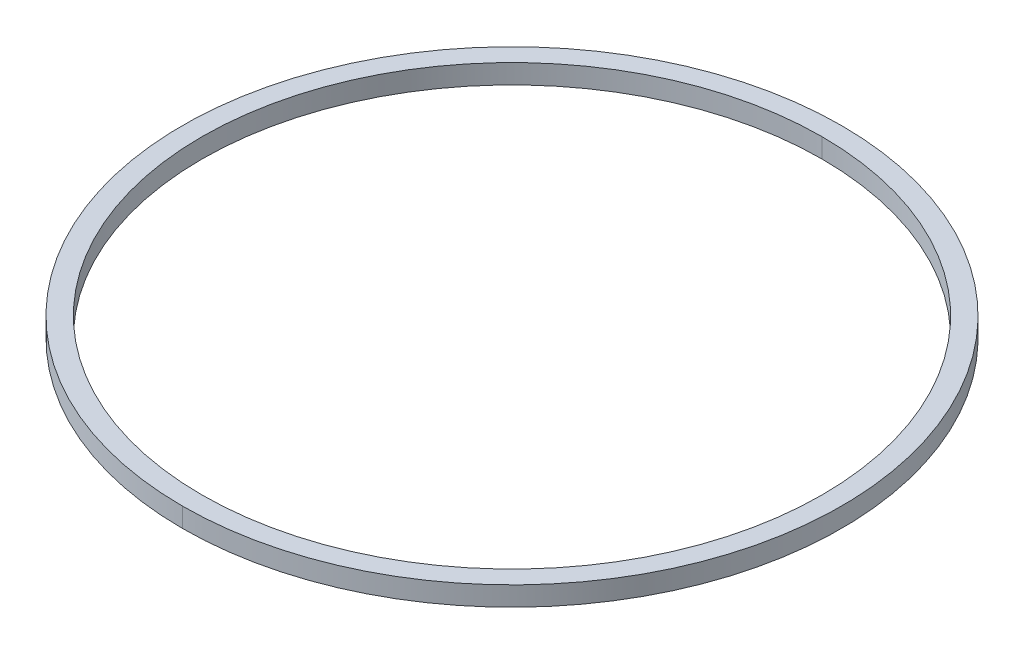
ISO-10303-21;
HEADER;
FILE_DESCRIPTION(('STEP AP214'),'2;1');
FILE_NAME('part.step','',(''),(''),'','','');
FILE_SCHEMA(('AUTOMOTIVE_DESIGN { 1 0 10303 214 1 1 1 1 }'));
ENDSEC;
DATA;
#1=APPLICATION_CONTEXT('core data for automotive mechanical design processes');
#2=APPLICATION_PROTOCOL_DEFINITION('international standard','automotive_design',2000,#1);
#3=PRODUCT_CONTEXT('',#1,'mechanical');
#4=PRODUCT('Part','Part','',(#3));
#5=PRODUCT_RELATED_PRODUCT_CATEGORY('part','',(#4));
#6=PRODUCT_DEFINITION_FORMATION('','',#4);
#7=PRODUCT_DEFINITION_CONTEXT('part definition',#1,'design');
#8=PRODUCT_DEFINITION('design','',#6,#7);
#9=PRODUCT_DEFINITION_SHAPE('','',#8);
#10=(LENGTH_UNIT() NAMED_UNIT(*) SI_UNIT(.MILLI.,.METRE.));
#11=(NAMED_UNIT(*) PLANE_ANGLE_UNIT() SI_UNIT($,.RADIAN.));
#12=(NAMED_UNIT(*) SI_UNIT($,.STERADIAN.) SOLID_ANGLE_UNIT());
#13=UNCERTAINTY_MEASURE_WITH_UNIT(LENGTH_MEASURE(1.E-05),#10,'distance_accuracy_value','');
#14=(GEOMETRIC_REPRESENTATION_CONTEXT(3) GLOBAL_UNCERTAINTY_ASSIGNED_CONTEXT((#13)) GLOBAL_UNIT_ASSIGNED_CONTEXT((#10,
#11,#12)) REPRESENTATION_CONTEXT('',''));
#15=CARTESIAN_POINT('',(0.,0.,0.));
#16=DIRECTION('',(0.,0.,1.));
#17=DIRECTION('',(1.,0.,0.));
#18=AXIS2_PLACEMENT_3D('',#15,#16,#17);
#19=CARTESIAN_POINT('',(0.,1.,0.));
#20=DIRECTION('',(0.,-1.,0.));
#21=DIRECTION('',(0.,0.,-1.));
#22=AXIS2_PLACEMENT_3D('',#19,#20,#21);
#23=CYLINDRICAL_SURFACE('',#22,16.);
#24=DIRECTION('',(0.,-1.,0.));
#25=VECTOR('',#24,1.);
#26=CARTESIAN_POINT('',(0.,1.,16.));
#27=LINE('',#26,#25);
#28=CARTESIAN_POINT('',(0.,1.,16.));
#29=VERTEX_POINT('',#28);
#30=CARTESIAN_POINT('',(0.,0.,16.));
#31=VERTEX_POINT('',#30);
#32=EDGE_CURVE('E73',#29,#31,#27,.T.);
#33=ORIENTED_EDGE('',*,*,#32,.F.);
#34=CARTESIAN_POINT('',(0.,1.,0.));
#35=DIRECTION('',(0.,1.,0.));
#36=DIRECTION('',(0.,0.,1.));
#37=AXIS2_PLACEMENT_3D('',#34,#35,#36);
#38=CIRCLE('',#37,16.);
#39=CARTESIAN_POINT('',(0.,1.,-16.));
#40=VERTEX_POINT('',#39);
#41=EDGE_CURVE('E97',#29,#40,#38,.T.);
#42=ORIENTED_EDGE('',*,*,#41,.T.);
#43=DIRECTION('',(0.,-1.,0.));
#44=VECTOR('',#43,1.);
#45=CARTESIAN_POINT('',(0.,1.,-16.));
#46=LINE('',#45,#44);
#47=CARTESIAN_POINT('',(0.,0.,-16.));
#48=VERTEX_POINT('',#47);
#49=EDGE_CURVE('E76',#40,#48,#46,.T.);
#50=ORIENTED_EDGE('',*,*,#49,.T.);
#51=CARTESIAN_POINT('',(0.,0.,0.));
#52=DIRECTION('',(0.,1.,0.));
#53=DIRECTION('',(0.,0.,1.));
#54=AXIS2_PLACEMENT_3D('',#51,#52,#53);
#55=CIRCLE('',#54,16.);
#56=EDGE_CURVE('E11',#31,#48,#55,.T.);
#57=ORIENTED_EDGE('',*,*,#56,.F.);
#58=EDGE_LOOP('',(#33,#42,#50,#57));
#59=FACE_BOUND('',#58,.T.);
#60=ADVANCED_FACE('F16',(#59),#23,.F.);
#61=CARTESIAN_POINT('',(0.,1.,0.));
#62=DIRECTION('',(0.,-1.,0.));
#63=DIRECTION('',(0.,0.,-1.));
#64=AXIS2_PLACEMENT_3D('',#61,#62,#63);
#65=CYLINDRICAL_SURFACE('',#64,17.);
#66=DIRECTION('',(0.,-1.,0.));
#67=VECTOR('',#66,1.);
#68=CARTESIAN_POINT('',(0.,1.,17.));
#69=LINE('',#68,#67);
#70=CARTESIAN_POINT('',(0.,1.,17.));
#71=VERTEX_POINT('',#70);
#72=CARTESIAN_POINT('',(0.,0.,17.));
#73=VERTEX_POINT('',#72);
#74=EDGE_CURVE('E20',#71,#73,#69,.T.);
#75=ORIENTED_EDGE('',*,*,#74,.F.);
#76=CARTESIAN_POINT('',(0.,1.,0.));
#77=DIRECTION('',(0.,1.,0.));
#78=DIRECTION('',(0.,0.,1.));
#79=AXIS2_PLACEMENT_3D('',#76,#77,#78);
#80=CIRCLE('',#79,17.);
#81=CARTESIAN_POINT('',(0.,1.,-17.));
#82=VERTEX_POINT('',#81);
#83=EDGE_CURVE('E100',#82,#71,#80,.T.);
#84=ORIENTED_EDGE('',*,*,#83,.F.);
#85=DIRECTION('',(0.,-1.,0.));
#86=VECTOR('',#85,1.);
#87=CARTESIAN_POINT('',(0.,1.,-17.));
#88=LINE('',#87,#86);
#89=CARTESIAN_POINT('',(0.,0.,-17.));
#90=VERTEX_POINT('',#89);
#91=EDGE_CURVE('E104',#82,#90,#88,.T.);
#92=ORIENTED_EDGE('',*,*,#91,.T.);
#93=CARTESIAN_POINT('',(0.,0.,0.));
#94=DIRECTION('',(0.,1.,0.));
#95=DIRECTION('',(0.,0.,1.));
#96=AXIS2_PLACEMENT_3D('',#93,#94,#95);
#97=CIRCLE('',#96,17.);
#98=EDGE_CURVE('E26',#90,#73,#97,.T.);
#99=ORIENTED_EDGE('',*,*,#98,.T.);
#100=EDGE_LOOP('',(#75,#84,#92,#99));
#101=FACE_BOUND('',#100,.T.);
#102=ADVANCED_FACE('F168',(#101),#65,.T.);
#103=CARTESIAN_POINT('',(0.,0.,0.));
#104=DIRECTION('',(0.,1.,0.));
#105=DIRECTION('',(1.,0.,0.));
#106=AXIS2_PLACEMENT_3D('',#103,#104,#105);
#107=PLANE('',#106);
#108=CARTESIAN_POINT('',(0.,0.,0.));
#109=DIRECTION('',(0.,1.,0.));
#110=DIRECTION('',(0.,0.,1.));
#111=AXIS2_PLACEMENT_3D('',#108,#109,#110);
#112=CIRCLE('',#111,16.);
#113=EDGE_CURVE('E79',#48,#31,#112,.T.);
#114=ORIENTED_EDGE('',*,*,#113,.T.);
#115=ORIENTED_EDGE('',*,*,#56,.T.);
#116=EDGE_LOOP('',(#114,#115));
#117=FACE_BOUND('',#116,.T.);
#118=ORIENTED_EDGE('',*,*,#98,.F.);
#119=CARTESIAN_POINT('',(0.,0.,0.));
#120=DIRECTION('',(0.,1.,0.));
#121=DIRECTION('',(0.,0.,1.));
#122=AXIS2_PLACEMENT_3D('',#119,#120,#121);
#123=CIRCLE('',#122,17.);
#124=EDGE_CURVE('E101',#73,#90,#123,.T.);
#125=ORIENTED_EDGE('',*,*,#124,.F.);
#126=EDGE_LOOP('',(#118,#125));
#127=FACE_BOUND('',#126,.T.);
#128=ADVANCED_FACE('F18',(#117,#127),#107,.F.);
#129=CARTESIAN_POINT('',(0.,1.,0.));
#130=DIRECTION('',(0.,1.,0.));
#131=DIRECTION('',(1.,0.,0.));
#132=AXIS2_PLACEMENT_3D('',#129,#130,#131);
#133=PLANE('',#132);
#134=CARTESIAN_POINT('',(0.,1.,0.));
#135=DIRECTION('',(0.,1.,0.));
#136=DIRECTION('',(0.,0.,1.));
#137=AXIS2_PLACEMENT_3D('',#134,#135,#136);
#138=CIRCLE('',#137,16.);
#139=EDGE_CURVE('E85',#40,#29,#138,.T.);
#140=ORIENTED_EDGE('',*,*,#139,.F.);
#141=ORIENTED_EDGE('',*,*,#41,.F.);
#142=EDGE_LOOP('',(#140,#141));
#143=FACE_BOUND('',#142,.T.);
#144=ORIENTED_EDGE('',*,*,#83,.T.);
#145=CARTESIAN_POINT('',(0.,1.,0.));
#146=DIRECTION('',(0.,1.,0.));
#147=DIRECTION('',(0.,0.,1.));
#148=AXIS2_PLACEMENT_3D('',#145,#146,#147);
#149=CIRCLE('',#148,17.);
#150=EDGE_CURVE('E96',#71,#82,#149,.T.);
#151=ORIENTED_EDGE('',*,*,#150,.T.);
#152=EDGE_LOOP('',(#144,#151));
#153=FACE_BOUND('',#152,.T.);
#154=ADVANCED_FACE('F162',(#143,#153),#133,.T.);
#155=CARTESIAN_POINT('',(0.,1.,0.));
#156=DIRECTION('',(0.,-1.,0.));
#157=DIRECTION('',(0.,0.,-1.));
#158=AXIS2_PLACEMENT_3D('',#155,#156,#157);
#159=CYLINDRICAL_SURFACE('',#158,17.);
#160=ORIENTED_EDGE('',*,*,#150,.F.);
#161=ORIENTED_EDGE('',*,*,#74,.T.);
#162=ORIENTED_EDGE('',*,*,#124,.T.);
#163=ORIENTED_EDGE('',*,*,#91,.F.);
#164=EDGE_LOOP('',(#160,#161,#162,#163));
#165=FACE_BOUND('',#164,.T.);
#166=ADVANCED_FACE('F158',(#165),#159,.T.);
#167=CARTESIAN_POINT('',(0.,1.,0.));
#168=DIRECTION('',(0.,-1.,0.));
#169=DIRECTION('',(0.,0.,-1.));
#170=AXIS2_PLACEMENT_3D('',#167,#168,#169);
#171=CYLINDRICAL_SURFACE('',#170,16.);
#172=ORIENTED_EDGE('',*,*,#139,.T.);
#173=ORIENTED_EDGE('',*,*,#32,.T.);
#174=ORIENTED_EDGE('',*,*,#113,.F.);
#175=ORIENTED_EDGE('',*,*,#49,.F.);
#176=EDGE_LOOP('',(#172,#173,#174,#175));
#177=FACE_BOUND('',#176,.T.);
#178=ADVANCED_FACE('F83',(#177),#171,.F.);
#179=CLOSED_SHELL('',(#60,#102,#128,#154,#166,#178));
#180=MANIFOLD_SOLID_BREP('B1',#179);
#181=ADVANCED_BREP_SHAPE_REPRESENTATION('',(#18,#180),#14);
#182=SHAPE_DEFINITION_REPRESENTATION(#9,#181);
ENDSEC;
END-ISO-10303-21;
